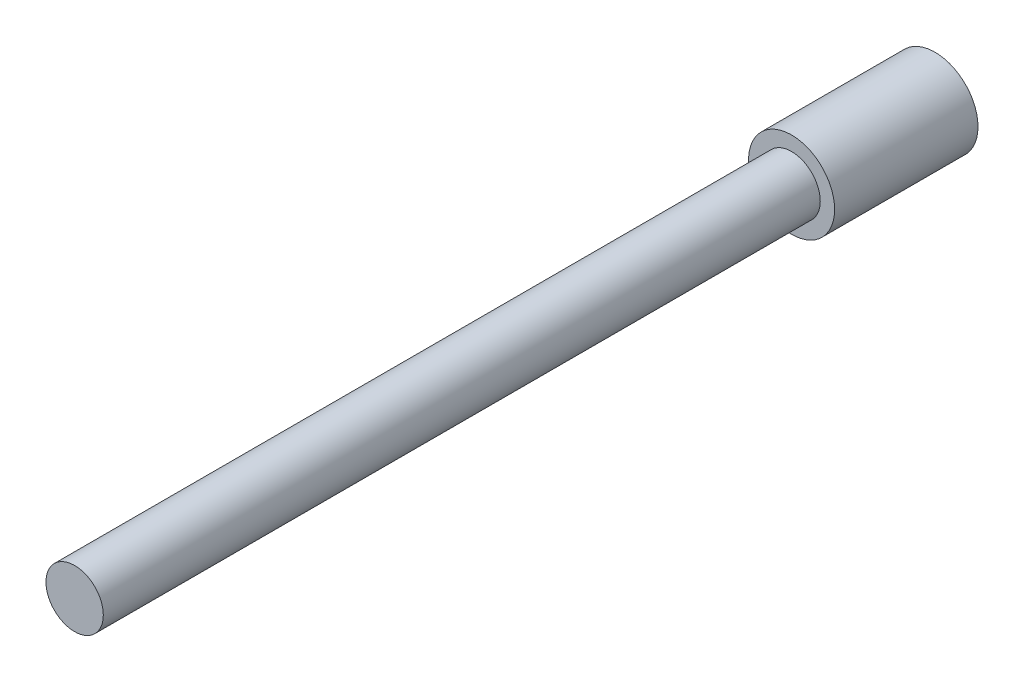
ISO-10303-21;
HEADER;
FILE_DESCRIPTION(('STEP AP214'),'2;1');
FILE_NAME('part.step','',(''),(''),'','','');
FILE_SCHEMA(('AUTOMOTIVE_DESIGN { 1 0 10303 214 1 1 1 1 }'));
ENDSEC;
DATA;
#1=APPLICATION_CONTEXT('core data for automotive mechanical design processes');
#2=APPLICATION_PROTOCOL_DEFINITION('international standard','automotive_design',2000,#1);
#3=PRODUCT_CONTEXT('',#1,'mechanical');
#4=PRODUCT('Part','Part','',(#3));
#5=PRODUCT_RELATED_PRODUCT_CATEGORY('part','',(#4));
#6=PRODUCT_DEFINITION_FORMATION('','',#4);
#7=PRODUCT_DEFINITION_CONTEXT('part definition',#1,'design');
#8=PRODUCT_DEFINITION('design','',#6,#7);
#9=PRODUCT_DEFINITION_SHAPE('','',#8);
#10=(LENGTH_UNIT() NAMED_UNIT(*) SI_UNIT(.MILLI.,.METRE.));
#11=(NAMED_UNIT(*) PLANE_ANGLE_UNIT() SI_UNIT($,.RADIAN.));
#12=(NAMED_UNIT(*) SI_UNIT($,.STERADIAN.) SOLID_ANGLE_UNIT());
#13=UNCERTAINTY_MEASURE_WITH_UNIT(LENGTH_MEASURE(1.E-05),#10,'distance_accuracy_value','');
#14=(GEOMETRIC_REPRESENTATION_CONTEXT(3) GLOBAL_UNCERTAINTY_ASSIGNED_CONTEXT((#13)) GLOBAL_UNIT_ASSIGNED_CONTEXT((#10,
#11,#12)) REPRESENTATION_CONTEXT('',''));
#15=CARTESIAN_POINT('',(0.,0.,0.));
#16=DIRECTION('',(0.,0.,1.));
#17=DIRECTION('',(1.,0.,0.));
#18=AXIS2_PLACEMENT_3D('',#15,#16,#17);
#19=CARTESIAN_POINT('',(0.,0.,-20.));
#20=DIRECTION('',(0.,0.,1.));
#21=DIRECTION('',(1.,0.,0.));
#22=AXIS2_PLACEMENT_3D('',#19,#20,#21);
#23=CYLINDRICAL_SURFACE('',#22,6.);
#24=CARTESIAN_POINT('',(0.,0.,-20.));
#25=DIRECTION('',(0.,0.,1.));
#26=DIRECTION('',(1.,0.,0.));
#27=AXIS2_PLACEMENT_3D('',#24,#25,#26);
#28=CIRCLE('',#27,6.);
#29=CARTESIAN_POINT('',(6.,0.,-20.));
#30=VERTEX_POINT('',#29);
#31=EDGE_CURVE('E10',#30,#30,#28,.T.);
#32=ORIENTED_EDGE('',*,*,#31,.T.);
#33=EDGE_LOOP('',(#32));
#34=FACE_BOUND('',#33,.T.);
#35=CARTESIAN_POINT('',(0.,0.,0.));
#36=DIRECTION('',(0.,0.,1.));
#37=DIRECTION('',(1.,0.,0.));
#38=AXIS2_PLACEMENT_3D('',#35,#36,#37);
#39=CIRCLE('',#38,6.);
#40=CARTESIAN_POINT('',(6.,0.,0.));
#41=VERTEX_POINT('',#40);
#42=EDGE_CURVE('E45',#41,#41,#39,.T.);
#43=ORIENTED_EDGE('',*,*,#42,.F.);
#44=EDGE_LOOP('',(#43));
#45=FACE_BOUND('',#44,.T.);
#46=ADVANCED_FACE('F31',(#34,#45),#23,.T.);
#47=CARTESIAN_POINT('',(6.,0.,-20.));
#48=DIRECTION('',(0.,0.,-1.));
#49=DIRECTION('',(-1.,0.,0.));
#50=AXIS2_PLACEMENT_3D('',#47,#48,#49);
#51=PLANE('',#50);
#52=ORIENTED_EDGE('',*,*,#31,.F.);
#53=EDGE_LOOP('',(#52));
#54=FACE_BOUND('',#53,.T.);
#55=ADVANCED_FACE('F55',(#54),#51,.T.);
#56=CARTESIAN_POINT('',(0.,0.,100.));
#57=DIRECTION('',(0.,0.,1.));
#58=DIRECTION('',(1.,0.,0.));
#59=AXIS2_PLACEMENT_3D('',#56,#57,#58);
#60=PLANE('',#59);
#61=CARTESIAN_POINT('',(0.,0.,100.));
#62=DIRECTION('',(0.,0.,1.));
#63=DIRECTION('',(1.,0.,0.));
#64=AXIS2_PLACEMENT_3D('',#61,#62,#63);
#65=CIRCLE('',#64,4.);
#66=CARTESIAN_POINT('',(4.,0.,100.));
#67=VERTEX_POINT('',#66);
#68=EDGE_CURVE('E37',#67,#67,#65,.T.);
#69=ORIENTED_EDGE('',*,*,#68,.T.);
#70=EDGE_LOOP('',(#69));
#71=FACE_BOUND('',#70,.T.);
#72=ADVANCED_FACE('F59',(#71),#60,.T.);
#73=CARTESIAN_POINT('',(0.,0.,-20.));
#74=DIRECTION('',(0.,0.,1.));
#75=DIRECTION('',(1.,0.,0.));
#76=AXIS2_PLACEMENT_3D('',#73,#74,#75);
#77=CYLINDRICAL_SURFACE('',#76,4.);
#78=CARTESIAN_POINT('',(0.,0.,0.));
#79=DIRECTION('',(0.,0.,1.));
#80=DIRECTION('',(1.,0.,0.));
#81=AXIS2_PLACEMENT_3D('',#78,#79,#80);
#82=CIRCLE('',#81,4.);
#83=CARTESIAN_POINT('',(4.,0.,0.));
#84=VERTEX_POINT('',#83);
#85=EDGE_CURVE('E41',#84,#84,#82,.T.);
#86=ORIENTED_EDGE('',*,*,#85,.T.);
#87=EDGE_LOOP('',(#86));
#88=FACE_BOUND('',#87,.T.);
#89=ORIENTED_EDGE('',*,*,#68,.F.);
#90=EDGE_LOOP('',(#89));
#91=FACE_BOUND('',#90,.T.);
#92=ADVANCED_FACE('F64',(#88,#91),#77,.T.);
#93=CARTESIAN_POINT('',(4.,0.,0.));
#94=DIRECTION('',(0.,0.,1.));
#95=DIRECTION('',(1.,0.,0.));
#96=AXIS2_PLACEMENT_3D('',#93,#94,#95);
#97=PLANE('',#96);
#98=ORIENTED_EDGE('',*,*,#42,.T.);
#99=EDGE_LOOP('',(#98));
#100=FACE_BOUND('',#99,.T.);
#101=ORIENTED_EDGE('',*,*,#85,.F.);
#102=EDGE_LOOP('',(#101));
#103=FACE_BOUND('',#102,.T.);
#104=ADVANCED_FACE('F51',(#100,#103),#97,.T.);
#105=CLOSED_SHELL('',(#46,#55,#72,#92,#104));
#106=MANIFOLD_SOLID_BREP('B2',#105);
#107=ADVANCED_BREP_SHAPE_REPRESENTATION('',(#18,#106),#14);
#108=SHAPE_DEFINITION_REPRESENTATION(#9,#107);
ENDSEC;
END-ISO-10303-21;
